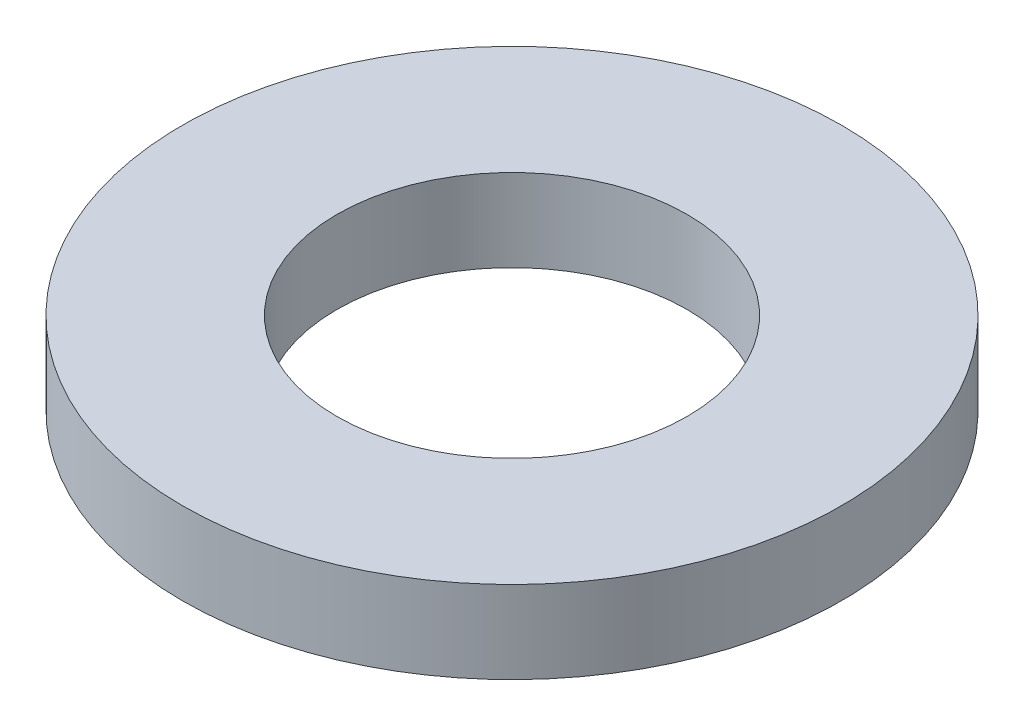
ISO-10303-21;
HEADER;
FILE_DESCRIPTION(('STEP AP214'),'2;1');
FILE_NAME('part.step','',(''),(''),'','','');
FILE_SCHEMA(('AUTOMOTIVE_DESIGN { 1 0 10303 214 1 1 1 1 }'));
ENDSEC;
DATA;
#1=APPLICATION_CONTEXT('core data for automotive mechanical design processes');
#2=APPLICATION_PROTOCOL_DEFINITION('international standard','automotive_design',2000,#1);
#3=PRODUCT_CONTEXT('',#1,'mechanical');
#4=PRODUCT('Part','Part','',(#3));
#5=PRODUCT_RELATED_PRODUCT_CATEGORY('part','',(#4));
#6=PRODUCT_DEFINITION_FORMATION('','',#4);
#7=PRODUCT_DEFINITION_CONTEXT('part definition',#1,'design');
#8=PRODUCT_DEFINITION('design','',#6,#7);
#9=PRODUCT_DEFINITION_SHAPE('','',#8);
#10=(LENGTH_UNIT() NAMED_UNIT(*) SI_UNIT(.MILLI.,.METRE.));
#11=(NAMED_UNIT(*) PLANE_ANGLE_UNIT() SI_UNIT($,.RADIAN.));
#12=(NAMED_UNIT(*) SI_UNIT($,.STERADIAN.) SOLID_ANGLE_UNIT());
#13=UNCERTAINTY_MEASURE_WITH_UNIT(LENGTH_MEASURE(1.E-05),#10,'distance_accuracy_value','');
#14=(GEOMETRIC_REPRESENTATION_CONTEXT(3) GLOBAL_UNCERTAINTY_ASSIGNED_CONTEXT((#13)) GLOBAL_UNIT_ASSIGNED_CONTEXT((#10,
#11,#12)) REPRESENTATION_CONTEXT('',''));
#15=CARTESIAN_POINT('',(0.,0.,0.));
#16=DIRECTION('',(0.,0.,1.));
#17=DIRECTION('',(1.,0.,0.));
#18=AXIS2_PLACEMENT_3D('',#15,#16,#17);
#19=CARTESIAN_POINT('',(0.,2.,0.));
#20=DIRECTION('',(0.,1.,0.));
#21=DIRECTION('',(0.,0.,1.));
#22=AXIS2_PLACEMENT_3D('',#19,#20,#21);
#23=PLANE('',#22);
#24=CARTESIAN_POINT('',(0.,2.,0.));
#25=DIRECTION('',(0.,1.,0.));
#26=DIRECTION('',(0.,0.,1.));
#27=AXIS2_PLACEMENT_3D('',#24,#25,#26);
#28=CIRCLE('',#27,8.);
#29=CARTESIAN_POINT('',(0.,2.,8.));
#30=VERTEX_POINT('',#29);
#31=EDGE_CURVE('E10',#30,#30,#28,.T.);
#32=ORIENTED_EDGE('',*,*,#31,.T.);
#33=EDGE_LOOP('',(#32));
#34=FACE_BOUND('',#33,.T.);
#35=CARTESIAN_POINT('',(0.,2.,0.));
#36=DIRECTION('',(0.,1.,0.));
#37=DIRECTION('',(0.,0.,1.));
#38=AXIS2_PLACEMENT_3D('',#35,#36,#37);
#39=CIRCLE('',#38,4.25);
#40=CARTESIAN_POINT('',(0.,2.,4.25));
#41=VERTEX_POINT('',#40);
#42=EDGE_CURVE('E46',#41,#41,#39,.T.);
#43=ORIENTED_EDGE('',*,*,#42,.F.);
#44=EDGE_LOOP('',(#43));
#45=FACE_BOUND('',#44,.T.);
#46=ADVANCED_FACE('F34',(#34,#45),#23,.T.);
#47=CARTESIAN_POINT('',(0.,0.,0.));
#48=DIRECTION('',(0.,1.,0.));
#49=DIRECTION('',(0.,0.,1.));
#50=AXIS2_PLACEMENT_3D('',#47,#48,#49);
#51=PLANE('',#50);
#52=CARTESIAN_POINT('',(0.,0.,0.));
#53=DIRECTION('',(0.,1.,0.));
#54=DIRECTION('',(0.,0.,1.));
#55=AXIS2_PLACEMENT_3D('',#52,#53,#54);
#56=CIRCLE('',#55,8.);
#57=CARTESIAN_POINT('',(0.,0.,8.));
#58=VERTEX_POINT('',#57);
#59=EDGE_CURVE('E39',#58,#58,#56,.T.);
#60=ORIENTED_EDGE('',*,*,#59,.F.);
#61=EDGE_LOOP('',(#60));
#62=FACE_BOUND('',#61,.T.);
#63=CARTESIAN_POINT('',(0.,0.,0.));
#64=DIRECTION('',(0.,1.,0.));
#65=DIRECTION('',(0.,0.,1.));
#66=AXIS2_PLACEMENT_3D('',#63,#64,#65);
#67=CIRCLE('',#66,4.25);
#68=CARTESIAN_POINT('',(0.,0.,4.25));
#69=VERTEX_POINT('',#68);
#70=EDGE_CURVE('E48',#69,#69,#67,.T.);
#71=ORIENTED_EDGE('',*,*,#70,.T.);
#72=EDGE_LOOP('',(#71));
#73=FACE_BOUND('',#72,.T.);
#74=ADVANCED_FACE('F59',(#62,#73),#51,.F.);
#75=CARTESIAN_POINT('',(0.,2.,0.));
#76=DIRECTION('',(0.,-1.,0.));
#77=DIRECTION('',(0.,0.,-1.));
#78=AXIS2_PLACEMENT_3D('',#75,#76,#77);
#79=CYLINDRICAL_SURFACE('',#78,8.);
#80=ORIENTED_EDGE('',*,*,#31,.F.);
#81=EDGE_LOOP('',(#80));
#82=FACE_BOUND('',#81,.T.);
#83=ORIENTED_EDGE('',*,*,#59,.T.);
#84=EDGE_LOOP('',(#83));
#85=FACE_BOUND('',#84,.T.);
#86=ADVANCED_FACE('F40',(#82,#85),#79,.T.);
#87=CARTESIAN_POINT('',(0.,2.,0.));
#88=DIRECTION('',(0.,-1.,0.));
#89=DIRECTION('',(0.,0.,-1.));
#90=AXIS2_PLACEMENT_3D('',#87,#88,#89);
#91=CYLINDRICAL_SURFACE('',#90,4.25);
#92=ORIENTED_EDGE('',*,*,#42,.T.);
#93=EDGE_LOOP('',(#92));
#94=FACE_BOUND('',#93,.T.);
#95=ORIENTED_EDGE('',*,*,#70,.F.);
#96=EDGE_LOOP('',(#95));
#97=FACE_BOUND('',#96,.T.);
#98=ADVANCED_FACE('F53',(#94,#97),#91,.F.);
#99=CLOSED_SHELL('',(#46,#74,#86,#98));
#100=MANIFOLD_SOLID_BREP('B2',#99);
#101=ADVANCED_BREP_SHAPE_REPRESENTATION('',(#18,#100),#14);
#102=SHAPE_DEFINITION_REPRESENTATION(#9,#101);
ENDSEC;
END-ISO-10303-21;
